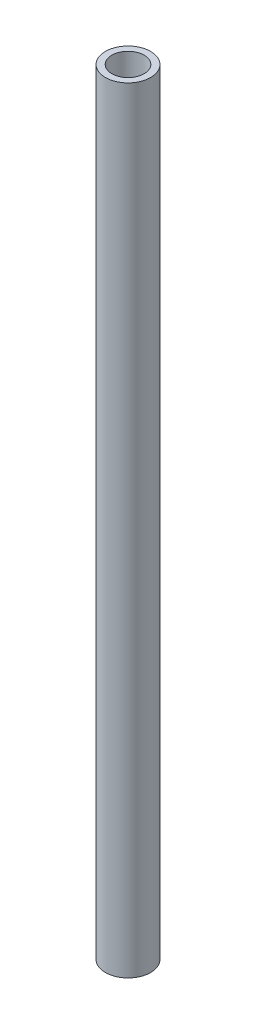
ISO-10303-21;
HEADER;
FILE_DESCRIPTION(('STEP AP214'),'2;1');
FILE_NAME('part.step','',(''),(''),'','','');
FILE_SCHEMA(('AUTOMOTIVE_DESIGN { 1 0 10303 214 1 1 1 1 }'));
ENDSEC;
DATA;
#1=APPLICATION_CONTEXT('core data for automotive mechanical design processes');
#2=APPLICATION_PROTOCOL_DEFINITION('international standard','automotive_design',2000,#1);
#3=PRODUCT_CONTEXT('',#1,'mechanical');
#4=PRODUCT('Part','Part','',(#3));
#5=PRODUCT_RELATED_PRODUCT_CATEGORY('part','',(#4));
#6=PRODUCT_DEFINITION_FORMATION('','',#4);
#7=PRODUCT_DEFINITION_CONTEXT('part definition',#1,'design');
#8=PRODUCT_DEFINITION('design','',#6,#7);
#9=PRODUCT_DEFINITION_SHAPE('','',#8);
#10=(LENGTH_UNIT() NAMED_UNIT(*) SI_UNIT(.MILLI.,.METRE.));
#11=(NAMED_UNIT(*) PLANE_ANGLE_UNIT() SI_UNIT($,.RADIAN.));
#12=(NAMED_UNIT(*) SI_UNIT($,.STERADIAN.) SOLID_ANGLE_UNIT());
#13=UNCERTAINTY_MEASURE_WITH_UNIT(LENGTH_MEASURE(1.E-05),#10,'distance_accuracy_value','');
#14=(GEOMETRIC_REPRESENTATION_CONTEXT(3) GLOBAL_UNCERTAINTY_ASSIGNED_CONTEXT((#13)) GLOBAL_UNIT_ASSIGNED_CONTEXT((#10,
#11,#12)) REPRESENTATION_CONTEXT('',''));
#15=CARTESIAN_POINT('',(0.,0.,0.));
#16=DIRECTION('',(0.,0.,1.));
#17=DIRECTION('',(1.,0.,0.));
#18=AXIS2_PLACEMENT_3D('',#15,#16,#17);
#19=CARTESIAN_POINT('',(2.50000000000002,60.,0.));
#20=DIRECTION('',(0.,1.,0.));
#21=DIRECTION('',(0.,0.,1.));
#22=AXIS2_PLACEMENT_3D('',#19,#20,#21);
#23=PLANE('',#22);
#24=CARTESIAN_POINT('',(0.,60.,0.));
#25=DIRECTION('',(0.,-1.,0.));
#26=DIRECTION('',(0.,0.,-1.));
#27=AXIS2_PLACEMENT_3D('',#24,#25,#26);
#28=CIRCLE('',#27,2.50000000000002);
#29=CARTESIAN_POINT('',(0.,60.,-2.50000000000002));
#30=VERTEX_POINT('',#29);
#31=EDGE_CURVE('E45',#30,#30,#28,.T.);
#32=ORIENTED_EDGE('',*,*,#31,.T.);
#33=EDGE_LOOP('',(#32));
#34=FACE_BOUND('',#33,.T.);
#35=CARTESIAN_POINT('',(0.,60.,0.));
#36=DIRECTION('',(0.,-1.,0.));
#37=DIRECTION('',(0.,0.,-1.));
#38=AXIS2_PLACEMENT_3D('',#35,#36,#37);
#39=CIRCLE('',#38,3.50000000000002);
#40=CARTESIAN_POINT('',(0.,60.,-3.50000000000002));
#41=VERTEX_POINT('',#40);
#42=EDGE_CURVE('E10',#41,#41,#39,.T.);
#43=ORIENTED_EDGE('',*,*,#42,.F.);
#44=EDGE_LOOP('',(#43));
#45=FACE_BOUND('',#44,.T.);
#46=ADVANCED_FACE('F31',(#34,#45),#23,.T.);
#47=CARTESIAN_POINT('',(0.,-84.5864661654135,0.));
#48=DIRECTION('',(0.,-1.,0.));
#49=DIRECTION('',(0.,0.,-1.));
#50=AXIS2_PLACEMENT_3D('',#47,#48,#49);
#51=CYLINDRICAL_SURFACE('',#50,3.50000000000002);
#52=ORIENTED_EDGE('',*,*,#42,.T.);
#53=EDGE_LOOP('',(#52));
#54=FACE_BOUND('',#53,.T.);
#55=CARTESIAN_POINT('',(0.,-60.,0.));
#56=DIRECTION('',(0.,-1.,0.));
#57=DIRECTION('',(0.,0.,-1.));
#58=AXIS2_PLACEMENT_3D('',#55,#56,#57);
#59=CIRCLE('',#58,3.50000000000002);
#60=CARTESIAN_POINT('',(0.,-60.,-3.50000000000002));
#61=VERTEX_POINT('',#60);
#62=EDGE_CURVE('E37',#61,#61,#59,.T.);
#63=ORIENTED_EDGE('',*,*,#62,.F.);
#64=EDGE_LOOP('',(#63));
#65=FACE_BOUND('',#64,.T.);
#66=ADVANCED_FACE('F61',(#54,#65),#51,.T.);
#67=CARTESIAN_POINT('',(3.50000000000002,-60.,0.));
#68=DIRECTION('',(0.,-1.,0.));
#69=DIRECTION('',(0.,0.,-1.));
#70=AXIS2_PLACEMENT_3D('',#67,#68,#69);
#71=PLANE('',#70);
#72=ORIENTED_EDGE('',*,*,#62,.T.);
#73=EDGE_LOOP('',(#72));
#74=FACE_BOUND('',#73,.T.);
#75=CARTESIAN_POINT('',(0.,-60.,0.));
#76=DIRECTION('',(0.,-1.,0.));
#77=DIRECTION('',(0.,0.,-1.));
#78=AXIS2_PLACEMENT_3D('',#75,#76,#77);
#79=CIRCLE('',#78,2.50000000000002);
#80=CARTESIAN_POINT('',(0.,-60.,-2.50000000000002));
#81=VERTEX_POINT('',#80);
#82=EDGE_CURVE('E41',#81,#81,#79,.T.);
#83=ORIENTED_EDGE('',*,*,#82,.F.);
#84=EDGE_LOOP('',(#83));
#85=FACE_BOUND('',#84,.T.);
#86=ADVANCED_FACE('F55',(#74,#85),#71,.T.);
#87=CARTESIAN_POINT('',(0.,-84.5864661654135,0.));
#88=DIRECTION('',(0.,-1.,0.));
#89=DIRECTION('',(0.,0.,-1.));
#90=AXIS2_PLACEMENT_3D('',#87,#88,#89);
#91=CYLINDRICAL_SURFACE('',#90,2.50000000000002);
#92=ORIENTED_EDGE('',*,*,#82,.T.);
#93=EDGE_LOOP('',(#92));
#94=FACE_BOUND('',#93,.T.);
#95=ORIENTED_EDGE('',*,*,#31,.F.);
#96=EDGE_LOOP('',(#95));
#97=FACE_BOUND('',#96,.T.);
#98=ADVANCED_FACE('F53',(#94,#97),#91,.F.);
#99=CLOSED_SHELL('',(#46,#66,#86,#98));
#100=MANIFOLD_SOLID_BREP('B2',#99);
#101=ADVANCED_BREP_SHAPE_REPRESENTATION('',(#18,#100),#14);
#102=SHAPE_DEFINITION_REPRESENTATION(#9,#101);
ENDSEC;
END-ISO-10303-21;
